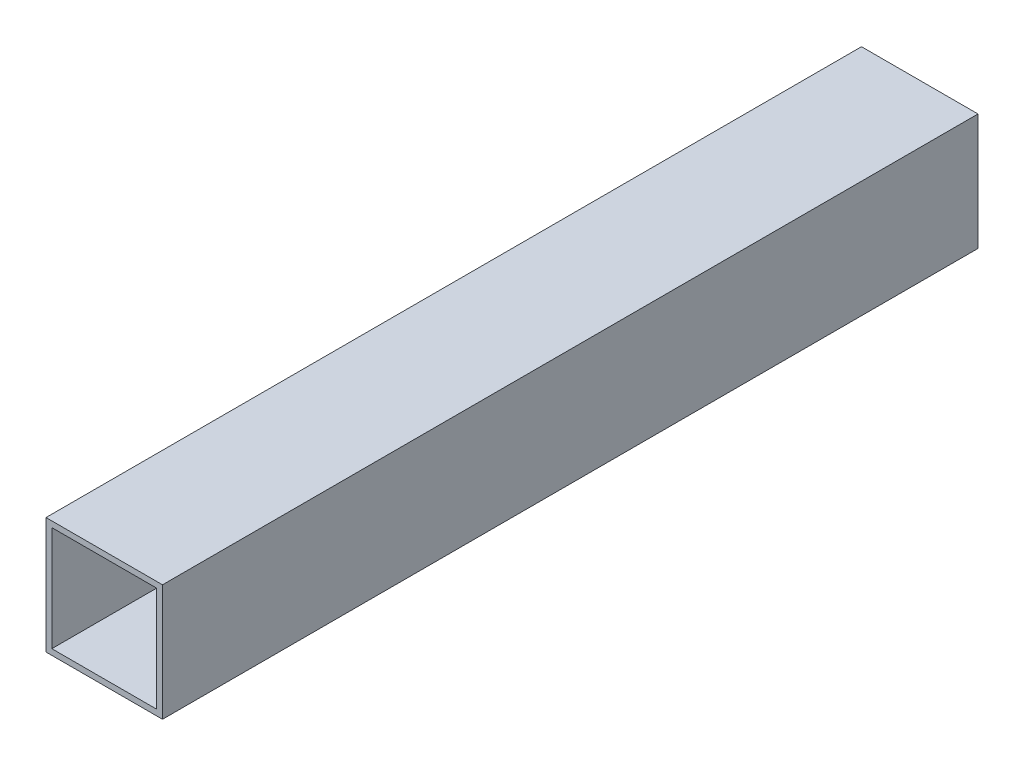
ISO-10303-21;
HEADER;
FILE_DESCRIPTION(('STEP AP214'),'2;1');
FILE_NAME('part.step','',(''),(''),'','','');
FILE_SCHEMA(('AUTOMOTIVE_DESIGN { 1 0 10303 214 1 1 1 1 }'));
ENDSEC;
DATA;
#1=APPLICATION_CONTEXT('core data for automotive mechanical design processes');
#2=APPLICATION_PROTOCOL_DEFINITION('international standard','automotive_design',2000,#1);
#3=PRODUCT_CONTEXT('',#1,'mechanical');
#4=PRODUCT('Part','Part','',(#3));
#5=PRODUCT_RELATED_PRODUCT_CATEGORY('part','',(#4));
#6=PRODUCT_DEFINITION_FORMATION('','',#4);
#7=PRODUCT_DEFINITION_CONTEXT('part definition',#1,'design');
#8=PRODUCT_DEFINITION('design','',#6,#7);
#9=PRODUCT_DEFINITION_SHAPE('','',#8);
#10=(LENGTH_UNIT() NAMED_UNIT(*) SI_UNIT(.MILLI.,.METRE.));
#11=(NAMED_UNIT(*) PLANE_ANGLE_UNIT() SI_UNIT($,.RADIAN.));
#12=(NAMED_UNIT(*) SI_UNIT($,.STERADIAN.) SOLID_ANGLE_UNIT());
#13=UNCERTAINTY_MEASURE_WITH_UNIT(LENGTH_MEASURE(1.E-05),#10,'distance_accuracy_value','');
#14=(GEOMETRIC_REPRESENTATION_CONTEXT(3) GLOBAL_UNCERTAINTY_ASSIGNED_CONTEXT((#13)) GLOBAL_UNIT_ASSIGNED_CONTEXT((#10,
#11,#12)) REPRESENTATION_CONTEXT('',''));
#15=CARTESIAN_POINT('',(0.,0.,0.));
#16=DIRECTION('',(0.,0.,1.));
#17=DIRECTION('',(1.,0.,0.));
#18=AXIS2_PLACEMENT_3D('',#15,#16,#17);
#19=CARTESIAN_POINT('',(0.,0.,355.6));
#20=DIRECTION('',(0.,0.,-1.));
#21=DIRECTION('',(-1.,0.,0.));
#22=AXIS2_PLACEMENT_3D('',#19,#20,#21);
#23=PLANE('',#22);
#24=DIRECTION('',(0.,-1.,0.));
#25=VECTOR('',#24,1.);
#26=CARTESIAN_POINT('',(1.63285714285714,0.,355.6));
#27=LINE('',#26,#25);
#28=CARTESIAN_POINT('',(1.63285714285714,50.8,355.6));
#29=VERTEX_POINT('',#28);
#30=CARTESIAN_POINT('',(1.63285714285714,0.,355.6));
#31=VERTEX_POINT('',#30);
#32=EDGE_CURVE('E134',#29,#31,#27,.T.);
#33=ORIENTED_EDGE('',*,*,#32,.T.);
#34=DIRECTION('',(1.,0.,0.));
#35=VECTOR('',#34,1.);
#36=CARTESIAN_POINT('',(1.63285714285714,0.,355.6));
#37=LINE('',#36,#35);
#38=CARTESIAN_POINT('',(52.4328571428571,0.,355.6));
#39=VERTEX_POINT('',#38);
#40=EDGE_CURVE('E137',#31,#39,#37,.T.);
#41=ORIENTED_EDGE('',*,*,#40,.T.);
#42=DIRECTION('',(0.,1.,0.));
#43=VECTOR('',#42,1.);
#44=CARTESIAN_POINT('',(52.4328571428571,0.,355.6));
#45=LINE('',#44,#43);
#46=CARTESIAN_POINT('',(52.4328571428571,50.8,355.6));
#47=VERTEX_POINT('',#46);
#48=EDGE_CURVE('E140',#39,#47,#45,.T.);
#49=ORIENTED_EDGE('',*,*,#48,.T.);
#50=DIRECTION('',(-1.,0.,0.));
#51=VECTOR('',#50,1.);
#52=CARTESIAN_POINT('',(1.63285714285714,50.8,355.6));
#53=LINE('',#52,#51);
#54=EDGE_CURVE('E142',#47,#29,#53,.T.);
#55=ORIENTED_EDGE('',*,*,#54,.T.);
#56=EDGE_LOOP('',(#33,#41,#49,#55));
#57=FACE_BOUND('',#56,.T.);
#58=DIRECTION('',(0.,-1.,0.));
#59=VECTOR('',#58,1.);
#60=CARTESIAN_POINT('',(4.17285714285714,2.54,355.6));
#61=LINE('',#60,#59);
#62=CARTESIAN_POINT('',(4.17285714285714,48.26,355.6));
#63=VERTEX_POINT('',#62);
#64=CARTESIAN_POINT('',(4.17285714285714,2.54,355.6));
#65=VERTEX_POINT('',#64);
#66=EDGE_CURVE('E98',#63,#65,#61,.T.);
#67=ORIENTED_EDGE('',*,*,#66,.F.);
#68=DIRECTION('',(-1.,0.,0.));
#69=VECTOR('',#68,1.);
#70=CARTESIAN_POINT('',(4.17285714285714,48.26,355.6));
#71=LINE('',#70,#69);
#72=CARTESIAN_POINT('',(49.8928571428571,48.26,355.6));
#73=VERTEX_POINT('',#72);
#74=EDGE_CURVE('E120',#73,#63,#71,.T.);
#75=ORIENTED_EDGE('',*,*,#74,.F.);
#76=DIRECTION('',(0.,1.,0.));
#77=VECTOR('',#76,1.);
#78=CARTESIAN_POINT('',(49.8928571428571,2.54,355.6));
#79=LINE('',#78,#77);
#80=CARTESIAN_POINT('',(49.8928571428571,2.54,355.6));
#81=VERTEX_POINT('',#80);
#82=EDGE_CURVE('E118',#81,#73,#79,.T.);
#83=ORIENTED_EDGE('',*,*,#82,.F.);
#84=DIRECTION('',(1.,0.,0.));
#85=VECTOR('',#84,1.);
#86=CARTESIAN_POINT('',(4.17285714285714,2.54,355.6));
#87=LINE('',#86,#85);
#88=EDGE_CURVE('E106',#65,#81,#87,.T.);
#89=ORIENTED_EDGE('',*,*,#88,.F.);
#90=EDGE_LOOP('',(#67,#75,#83,#89));
#91=FACE_BOUND('',#90,.T.);
#92=ADVANCED_FACE('F33',(#57,#91),#23,.F.);
#93=CARTESIAN_POINT('',(0.,0.,0.));
#94=DIRECTION('',(0.,0.,-1.));
#95=DIRECTION('',(-1.,0.,0.));
#96=AXIS2_PLACEMENT_3D('',#93,#94,#95);
#97=PLANE('',#96);
#98=DIRECTION('',(0.,-1.,0.));
#99=VECTOR('',#98,1.);
#100=CARTESIAN_POINT('',(1.63285714285714,0.,0.));
#101=LINE('',#100,#99);
#102=CARTESIAN_POINT('',(1.63285714285714,50.8,0.));
#103=VERTEX_POINT('',#102);
#104=CARTESIAN_POINT('',(1.63285714285714,0.,0.));
#105=VERTEX_POINT('',#104);
#106=EDGE_CURVE('E114',#103,#105,#101,.T.);
#107=ORIENTED_EDGE('',*,*,#106,.F.);
#108=DIRECTION('',(-1.,0.,0.));
#109=VECTOR('',#108,1.);
#110=CARTESIAN_POINT('',(1.63285714285714,50.8,0.));
#111=LINE('',#110,#109);
#112=CARTESIAN_POINT('',(52.4328571428571,50.8,0.));
#113=VERTEX_POINT('',#112);
#114=EDGE_CURVE('E138',#113,#103,#111,.T.);
#115=ORIENTED_EDGE('',*,*,#114,.F.);
#116=DIRECTION('',(0.,1.,0.));
#117=VECTOR('',#116,1.);
#118=CARTESIAN_POINT('',(52.4328571428571,0.,0.));
#119=LINE('',#118,#117);
#120=CARTESIAN_POINT('',(52.4328571428571,0.,0.));
#121=VERTEX_POINT('',#120);
#122=EDGE_CURVE('E149',#121,#113,#119,.T.);
#123=ORIENTED_EDGE('',*,*,#122,.F.);
#124=DIRECTION('',(1.,0.,0.));
#125=VECTOR('',#124,1.);
#126=CARTESIAN_POINT('',(1.63285714285714,0.,0.));
#127=LINE('',#126,#125);
#128=EDGE_CURVE('E147',#105,#121,#127,.T.);
#129=ORIENTED_EDGE('',*,*,#128,.F.);
#130=EDGE_LOOP('',(#107,#115,#123,#129));
#131=FACE_BOUND('',#130,.T.);
#132=DIRECTION('',(-1.,0.,0.));
#133=VECTOR('',#132,1.);
#134=CARTESIAN_POINT('',(4.17285714285714,48.26,0.));
#135=LINE('',#134,#133);
#136=CARTESIAN_POINT('',(49.8928571428571,48.26,0.));
#137=VERTEX_POINT('',#136);
#138=CARTESIAN_POINT('',(4.17285714285714,48.26,0.));
#139=VERTEX_POINT('',#138);
#140=EDGE_CURVE('E107',#137,#139,#135,.T.);
#141=ORIENTED_EDGE('',*,*,#140,.T.);
#142=DIRECTION('',(0.,-1.,0.));
#143=VECTOR('',#142,1.);
#144=CARTESIAN_POINT('',(4.17285714285714,2.54,0.));
#145=LINE('',#144,#143);
#146=CARTESIAN_POINT('',(4.17285714285714,2.54,0.));
#147=VERTEX_POINT('',#146);
#148=EDGE_CURVE('E56',#139,#147,#145,.T.);
#149=ORIENTED_EDGE('',*,*,#148,.T.);
#150=DIRECTION('',(1.,0.,0.));
#151=VECTOR('',#150,1.);
#152=CARTESIAN_POINT('',(4.17285714285714,2.54,0.));
#153=LINE('',#152,#151);
#154=CARTESIAN_POINT('',(49.8928571428571,2.54,0.));
#155=VERTEX_POINT('',#154);
#156=EDGE_CURVE('E113',#147,#155,#153,.T.);
#157=ORIENTED_EDGE('',*,*,#156,.T.);
#158=DIRECTION('',(0.,1.,0.));
#159=VECTOR('',#158,1.);
#160=CARTESIAN_POINT('',(49.8928571428571,2.54,0.));
#161=LINE('',#160,#159);
#162=EDGE_CURVE('E126',#155,#137,#161,.T.);
#163=ORIENTED_EDGE('',*,*,#162,.T.);
#164=EDGE_LOOP('',(#141,#149,#157,#163));
#165=FACE_BOUND('',#164,.T.);
#166=ADVANCED_FACE('F167',(#131,#165),#97,.T.);
#167=CARTESIAN_POINT('',(1.63285714285714,0.,355.6));
#168=DIRECTION('',(1.,0.,0.));
#169=DIRECTION('',(0.,0.,-1.));
#170=AXIS2_PLACEMENT_3D('',#167,#168,#169);
#171=PLANE('',#170);
#172=ORIENTED_EDGE('',*,*,#106,.T.);
#173=DIRECTION('',(0.,0.,-1.));
#174=VECTOR('',#173,1.);
#175=CARTESIAN_POINT('',(1.63285714285714,0.,355.6));
#176=LINE('',#175,#174);
#177=EDGE_CURVE('E11',#31,#105,#176,.T.);
#178=ORIENTED_EDGE('',*,*,#177,.F.);
#179=ORIENTED_EDGE('',*,*,#32,.F.);
#180=DIRECTION('',(0.,0.,-1.));
#181=VECTOR('',#180,1.);
#182=CARTESIAN_POINT('',(1.63285714285714,50.8,355.6));
#183=LINE('',#182,#181);
#184=EDGE_CURVE('E144',#29,#103,#183,.T.);
#185=ORIENTED_EDGE('',*,*,#184,.T.);
#186=EDGE_LOOP('',(#172,#178,#179,#185));
#187=FACE_BOUND('',#186,.T.);
#188=ADVANCED_FACE('F35',(#187),#171,.F.);
#189=CARTESIAN_POINT('',(1.63285714285714,0.,355.6));
#190=DIRECTION('',(0.,1.,0.));
#191=DIRECTION('',(0.,0.,1.));
#192=AXIS2_PLACEMENT_3D('',#189,#190,#191);
#193=PLANE('',#192);
#194=ORIENTED_EDGE('',*,*,#128,.T.);
#195=DIRECTION('',(0.,0.,-1.));
#196=VECTOR('',#195,1.);
#197=CARTESIAN_POINT('',(52.4328571428571,0.,355.6));
#198=LINE('',#197,#196);
#199=EDGE_CURVE('E41',#39,#121,#198,.T.);
#200=ORIENTED_EDGE('',*,*,#199,.F.);
#201=ORIENTED_EDGE('',*,*,#40,.F.);
#202=ORIENTED_EDGE('',*,*,#177,.T.);
#203=EDGE_LOOP('',(#194,#200,#201,#202));
#204=FACE_BOUND('',#203,.T.);
#205=ADVANCED_FACE('F177',(#204),#193,.F.);
#206=CARTESIAN_POINT('',(52.4328571428571,0.,355.6));
#207=DIRECTION('',(-1.,0.,0.));
#208=DIRECTION('',(0.,0.,1.));
#209=AXIS2_PLACEMENT_3D('',#206,#207,#208);
#210=PLANE('',#209);
#211=ORIENTED_EDGE('',*,*,#122,.T.);
#212=DIRECTION('',(0.,0.,-1.));
#213=VECTOR('',#212,1.);
#214=CARTESIAN_POINT('',(52.4328571428571,50.8,355.6));
#215=LINE('',#214,#213);
#216=EDGE_CURVE('E154',#47,#113,#215,.T.);
#217=ORIENTED_EDGE('',*,*,#216,.F.);
#218=ORIENTED_EDGE('',*,*,#48,.F.);
#219=ORIENTED_EDGE('',*,*,#199,.T.);
#220=EDGE_LOOP('',(#211,#217,#218,#219));
#221=FACE_BOUND('',#220,.T.);
#222=ADVANCED_FACE('F161',(#221),#210,.F.);
#223=CARTESIAN_POINT('',(1.63285714285714,50.8,355.6));
#224=DIRECTION('',(0.,-1.,0.));
#225=DIRECTION('',(0.,0.,-1.));
#226=AXIS2_PLACEMENT_3D('',#223,#224,#225);
#227=PLANE('',#226);
#228=ORIENTED_EDGE('',*,*,#114,.T.);
#229=ORIENTED_EDGE('',*,*,#184,.F.);
#230=ORIENTED_EDGE('',*,*,#54,.F.);
#231=ORIENTED_EDGE('',*,*,#216,.T.);
#232=EDGE_LOOP('',(#228,#229,#230,#231));
#233=FACE_BOUND('',#232,.T.);
#234=ADVANCED_FACE('F171',(#233),#227,.F.);
#235=CARTESIAN_POINT('',(4.17285714285714,2.54,355.6));
#236=DIRECTION('',(1.,0.,0.));
#237=DIRECTION('',(0.,0.,-1.));
#238=AXIS2_PLACEMENT_3D('',#235,#236,#237);
#239=PLANE('',#238);
#240=ORIENTED_EDGE('',*,*,#148,.F.);
#241=DIRECTION('',(0.,0.,-1.));
#242=VECTOR('',#241,1.);
#243=CARTESIAN_POINT('',(4.17285714285714,48.26,355.6));
#244=LINE('',#243,#242);
#245=EDGE_CURVE('E102',#63,#139,#244,.T.);
#246=ORIENTED_EDGE('',*,*,#245,.F.);
#247=ORIENTED_EDGE('',*,*,#66,.T.);
#248=DIRECTION('',(0.,0.,-1.));
#249=VECTOR('',#248,1.);
#250=CARTESIAN_POINT('',(4.17285714285714,2.54,355.6));
#251=LINE('',#250,#249);
#252=EDGE_CURVE('E101',#65,#147,#251,.T.);
#253=ORIENTED_EDGE('',*,*,#252,.T.);
#254=EDGE_LOOP('',(#240,#246,#247,#253));
#255=FACE_BOUND('',#254,.T.);
#256=ADVANCED_FACE('F100',(#255),#239,.T.);
#257=CARTESIAN_POINT('',(4.17285714285714,2.54,355.6));
#258=DIRECTION('',(0.,1.,0.));
#259=DIRECTION('',(0.,0.,1.));
#260=AXIS2_PLACEMENT_3D('',#257,#258,#259);
#261=PLANE('',#260);
#262=ORIENTED_EDGE('',*,*,#156,.F.);
#263=ORIENTED_EDGE('',*,*,#252,.F.);
#264=ORIENTED_EDGE('',*,*,#88,.T.);
#265=DIRECTION('',(0.,0.,-1.));
#266=VECTOR('',#265,1.);
#267=CARTESIAN_POINT('',(49.8928571428571,2.54,355.6));
#268=LINE('',#267,#266);
#269=EDGE_CURVE('E115',#81,#155,#268,.T.);
#270=ORIENTED_EDGE('',*,*,#269,.T.);
#271=EDGE_LOOP('',(#262,#263,#264,#270));
#272=FACE_BOUND('',#271,.T.);
#273=ADVANCED_FACE('F110',(#272),#261,.T.);
#274=CARTESIAN_POINT('',(49.8928571428571,2.54,355.6));
#275=DIRECTION('',(-1.,0.,0.));
#276=DIRECTION('',(0.,0.,1.));
#277=AXIS2_PLACEMENT_3D('',#274,#275,#276);
#278=PLANE('',#277);
#279=ORIENTED_EDGE('',*,*,#162,.F.);
#280=ORIENTED_EDGE('',*,*,#269,.F.);
#281=ORIENTED_EDGE('',*,*,#82,.T.);
#282=DIRECTION('',(0.,0.,-1.));
#283=VECTOR('',#282,1.);
#284=CARTESIAN_POINT('',(49.8928571428571,48.26,355.6));
#285=LINE('',#284,#283);
#286=EDGE_CURVE('E48',#73,#137,#285,.T.);
#287=ORIENTED_EDGE('',*,*,#286,.T.);
#288=EDGE_LOOP('',(#279,#280,#281,#287));
#289=FACE_BOUND('',#288,.T.);
#290=ADVANCED_FACE('F200',(#289),#278,.T.);
#291=CARTESIAN_POINT('',(4.17285714285714,48.26,355.6));
#292=DIRECTION('',(0.,-1.,0.));
#293=DIRECTION('',(0.,0.,-1.));
#294=AXIS2_PLACEMENT_3D('',#291,#292,#293);
#295=PLANE('',#294);
#296=ORIENTED_EDGE('',*,*,#140,.F.);
#297=ORIENTED_EDGE('',*,*,#286,.F.);
#298=ORIENTED_EDGE('',*,*,#74,.T.);
#299=ORIENTED_EDGE('',*,*,#245,.T.);
#300=EDGE_LOOP('',(#296,#297,#298,#299));
#301=FACE_BOUND('',#300,.T.);
#302=ADVANCED_FACE('F204',(#301),#295,.T.);
#303=CLOSED_SHELL('',(#92,#166,#188,#205,#222,#234,#256,#273,#290,#302));
#304=MANIFOLD_SOLID_BREP('B2',#303);
#305=ADVANCED_BREP_SHAPE_REPRESENTATION('',(#18,#304),#14);
#306=SHAPE_DEFINITION_REPRESENTATION(#9,#305);
ENDSEC;
END-ISO-10303-21;
